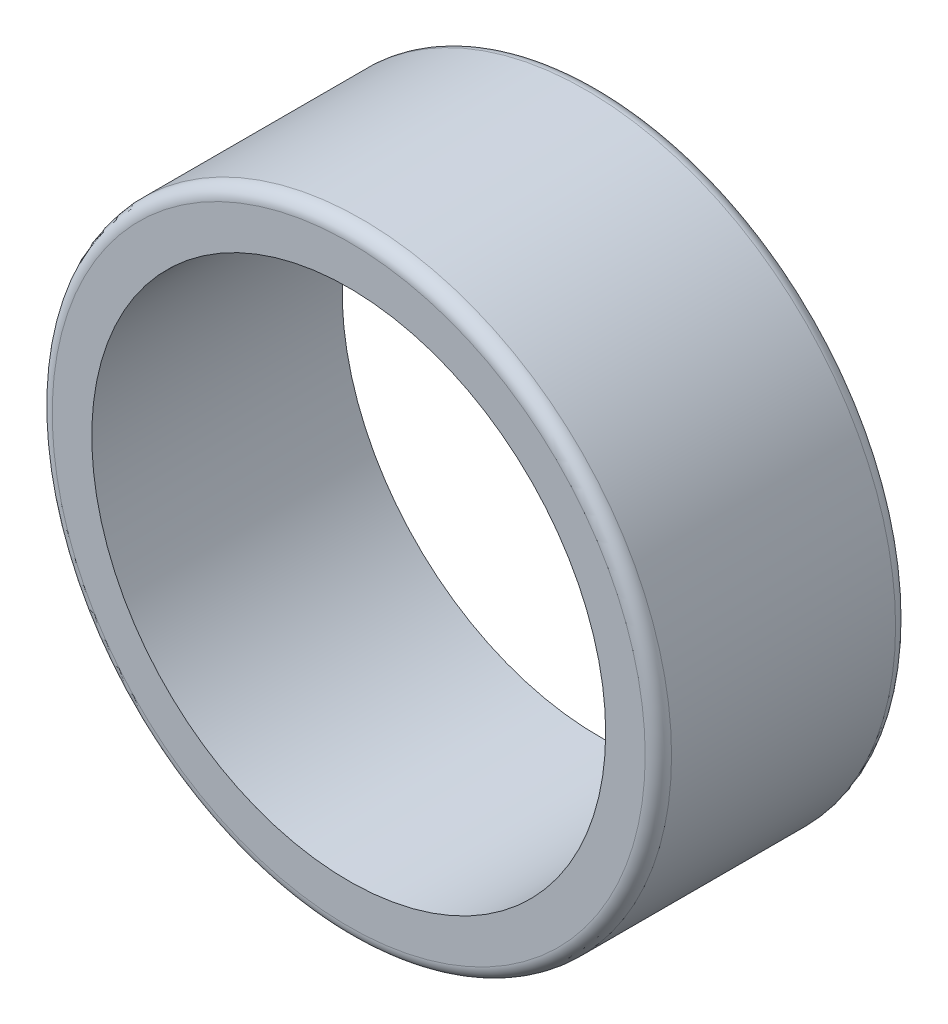
ISO-10303-21;
HEADER;
FILE_DESCRIPTION(('STEP AP214'),'2;1');
FILE_NAME('part.step','',(''),(''),'','','');
FILE_SCHEMA(('AUTOMOTIVE_DESIGN { 1 0 10303 214 1 1 1 1 }'));
ENDSEC;
DATA;
#1=APPLICATION_CONTEXT('core data for automotive mechanical design processes');
#2=APPLICATION_PROTOCOL_DEFINITION('international standard','automotive_design',2000,#1);
#3=PRODUCT_CONTEXT('',#1,'mechanical');
#4=PRODUCT('Part','Part','',(#3));
#5=PRODUCT_RELATED_PRODUCT_CATEGORY('part','',(#4));
#6=PRODUCT_DEFINITION_FORMATION('','',#4);
#7=PRODUCT_DEFINITION_CONTEXT('part definition',#1,'design');
#8=PRODUCT_DEFINITION('design','',#6,#7);
#9=PRODUCT_DEFINITION_SHAPE('','',#8);
#10=(LENGTH_UNIT() NAMED_UNIT(*) SI_UNIT(.MILLI.,.METRE.));
#11=(NAMED_UNIT(*) PLANE_ANGLE_UNIT() SI_UNIT($,.RADIAN.));
#12=(NAMED_UNIT(*) SI_UNIT($,.STERADIAN.) SOLID_ANGLE_UNIT());
#13=UNCERTAINTY_MEASURE_WITH_UNIT(LENGTH_MEASURE(1.E-05),#10,'distance_accuracy_value','');
#14=(GEOMETRIC_REPRESENTATION_CONTEXT(3) GLOBAL_UNCERTAINTY_ASSIGNED_CONTEXT((#13)) GLOBAL_UNIT_ASSIGNED_CONTEXT((#10,
#11,#12)) REPRESENTATION_CONTEXT('',''));
#15=CARTESIAN_POINT('',(0.,0.,0.));
#16=DIRECTION('',(0.,0.,1.));
#17=DIRECTION('',(1.,0.,0.));
#18=AXIS2_PLACEMENT_3D('',#15,#16,#17);
#19=CARTESIAN_POINT('',(0.,0.,9.5));
#20=DIRECTION('',(0.,0.,1.));
#21=DIRECTION('',(1.,0.,0.));
#22=AXIS2_PLACEMENT_3D('',#19,#20,#21);
#23=PLANE('',#22);
#24=CARTESIAN_POINT('',(0.,0.,9.5));
#25=DIRECTION('',(0.,0.,1.));
#26=DIRECTION('',(1.,0.,0.));
#27=AXIS2_PLACEMENT_3D('',#24,#25,#26);
#28=CIRCLE('',#27,11.25);
#29=CARTESIAN_POINT('',(11.25,0.,9.5));
#30=VERTEX_POINT('',#29);
#31=EDGE_CURVE('E43',#30,#30,#28,.T.);
#32=ORIENTED_EDGE('',*,*,#31,.T.);
#33=EDGE_LOOP('',(#32));
#34=FACE_BOUND('',#33,.T.);
#35=CARTESIAN_POINT('',(0.,0.,9.5));
#36=DIRECTION('',(0.,0.,1.));
#37=DIRECTION('',(1.,0.,0.));
#38=AXIS2_PLACEMENT_3D('',#35,#36,#37);
#39=CIRCLE('',#38,9.75);
#40=CARTESIAN_POINT('',(9.75,0.,9.5));
#41=VERTEX_POINT('',#40);
#42=EDGE_CURVE('E48',#41,#41,#39,.T.);
#43=ORIENTED_EDGE('',*,*,#42,.F.);
#44=EDGE_LOOP('',(#43));
#45=FACE_BOUND('',#44,.T.);
#46=ADVANCED_FACE('F28',(#34,#45),#23,.T.);
#47=CARTESIAN_POINT('',(0.,0.,0.));
#48=DIRECTION('',(0.,0.,1.));
#49=DIRECTION('',(1.,0.,0.));
#50=AXIS2_PLACEMENT_3D('',#47,#48,#49);
#51=PLANE('',#50);
#52=CARTESIAN_POINT('',(0.,0.,0.));
#53=DIRECTION('',(0.,0.,1.));
#54=DIRECTION('',(1.,0.,0.));
#55=AXIS2_PLACEMENT_3D('',#52,#53,#54);
#56=CIRCLE('',#55,11.25);
#57=CARTESIAN_POINT('',(11.25,0.,0.));
#58=VERTEX_POINT('',#57);
#59=EDGE_CURVE('E10',#58,#58,#56,.F.);
#60=ORIENTED_EDGE('',*,*,#59,.T.);
#61=EDGE_LOOP('',(#60));
#62=FACE_BOUND('',#61,.T.);
#63=CARTESIAN_POINT('',(0.,0.,0.));
#64=DIRECTION('',(0.,0.,1.));
#65=DIRECTION('',(1.,0.,0.));
#66=AXIS2_PLACEMENT_3D('',#63,#64,#65);
#67=CIRCLE('',#66,9.75);
#68=CARTESIAN_POINT('',(9.75,0.,0.));
#69=VERTEX_POINT('',#68);
#70=EDGE_CURVE('E51',#69,#69,#67,.T.);
#71=ORIENTED_EDGE('',*,*,#70,.T.);
#72=EDGE_LOOP('',(#71));
#73=FACE_BOUND('',#72,.T.);
#74=ADVANCED_FACE('F55',(#62,#73),#51,.F.);
#75=CARTESIAN_POINT('',(0.,0.,9.5));
#76=DIRECTION('',(0.,0.,-1.));
#77=DIRECTION('',(-1.,0.,0.));
#78=AXIS2_PLACEMENT_3D('',#75,#76,#77);
#79=CYLINDRICAL_SURFACE('',#78,11.75);
#80=CARTESIAN_POINT('',(0.,0.,0.5));
#81=DIRECTION('',(0.,0.,1.));
#82=DIRECTION('',(1.,0.,0.));
#83=AXIS2_PLACEMENT_3D('',#80,#81,#82);
#84=CIRCLE('',#83,11.75);
#85=CARTESIAN_POINT('',(11.75,0.,0.5));
#86=VERTEX_POINT('',#85);
#87=EDGE_CURVE('E35',#86,#86,#84,.T.);
#88=ORIENTED_EDGE('',*,*,#87,.T.);
#89=EDGE_LOOP('',(#88));
#90=FACE_BOUND('',#89,.T.);
#91=CARTESIAN_POINT('',(0.,0.,9.));
#92=DIRECTION('',(0.,0.,1.));
#93=DIRECTION('',(1.,0.,0.));
#94=AXIS2_PLACEMENT_3D('',#91,#92,#93);
#95=CIRCLE('',#94,11.75);
#96=CARTESIAN_POINT('',(11.75,0.,9.));
#97=VERTEX_POINT('',#96);
#98=EDGE_CURVE('E39',#97,#97,#95,.F.);
#99=ORIENTED_EDGE('',*,*,#98,.T.);
#100=EDGE_LOOP('',(#99));
#101=FACE_BOUND('',#100,.T.);
#102=ADVANCED_FACE('F30',(#90,#101),#79,.T.);
#103=CARTESIAN_POINT('',(0.,0.,9.5));
#104=DIRECTION('',(0.,0.,-1.));
#105=DIRECTION('',(-1.,0.,0.));
#106=AXIS2_PLACEMENT_3D('',#103,#104,#105);
#107=CYLINDRICAL_SURFACE('',#106,9.75);
#108=ORIENTED_EDGE('',*,*,#42,.T.);
#109=EDGE_LOOP('',(#108));
#110=FACE_BOUND('',#109,.T.);
#111=ORIENTED_EDGE('',*,*,#70,.F.);
#112=EDGE_LOOP('',(#111));
#113=FACE_BOUND('',#112,.T.);
#114=ADVANCED_FACE('F57',(#110,#113),#107,.F.);
#115=CARTESIAN_POINT('',(0.,0.,9.));
#116=DIRECTION('',(0.,0.,1.));
#117=DIRECTION('',(1.,0.,0.));
#118=AXIS2_PLACEMENT_3D('',#115,#116,#117);
#119=TOROIDAL_SURFACE('',#118,11.25,0.5);
#120=ORIENTED_EDGE('',*,*,#98,.F.);
#121=EDGE_LOOP('',(#120));
#122=FACE_BOUND('',#121,.T.);
#123=ORIENTED_EDGE('',*,*,#31,.F.);
#124=EDGE_LOOP('',(#123));
#125=FACE_BOUND('',#124,.T.);
#126=ADVANCED_FACE('F59',(#122,#125),#119,.T.);
#127=CARTESIAN_POINT('',(0.,0.,0.5));
#128=DIRECTION('',(0.,0.,1.));
#129=DIRECTION('',(1.,0.,0.));
#130=AXIS2_PLACEMENT_3D('',#127,#128,#129);
#131=TOROIDAL_SURFACE('',#130,11.25,0.5);
#132=ORIENTED_EDGE('',*,*,#59,.F.);
#133=EDGE_LOOP('',(#132));
#134=FACE_BOUND('',#133,.T.);
#135=ORIENTED_EDGE('',*,*,#87,.F.);
#136=EDGE_LOOP('',(#135));
#137=FACE_BOUND('',#136,.T.);
#138=ADVANCED_FACE('F66',(#134,#137),#131,.T.);
#139=CLOSED_SHELL('',(#46,#74,#102,#114,#126,#138));
#140=MANIFOLD_SOLID_BREP('B2',#139);
#141=ADVANCED_BREP_SHAPE_REPRESENTATION('',(#18,#140),#14);
#142=SHAPE_DEFINITION_REPRESENTATION(#9,#141);
ENDSEC;
END-ISO-10303-21;
